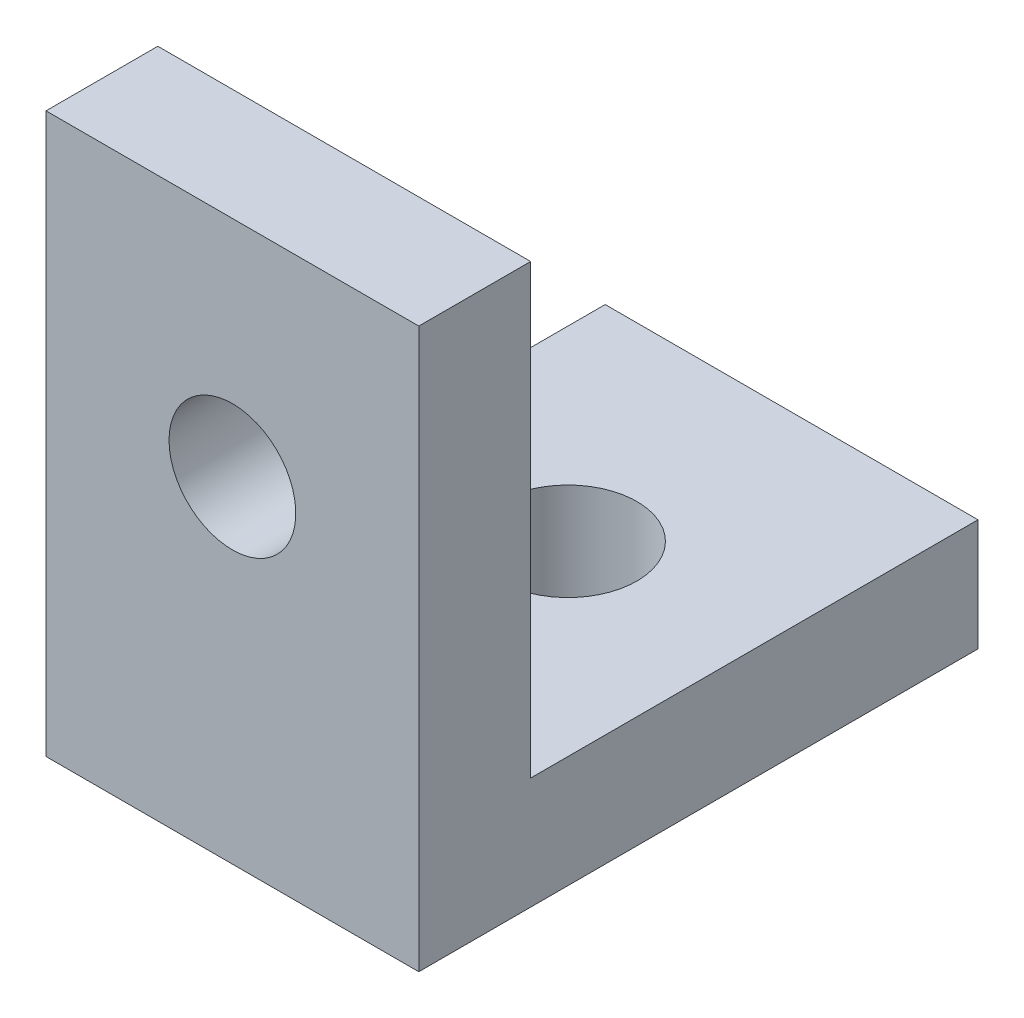
ISO-10303-21;
HEADER;
FILE_DESCRIPTION(('STEP AP214'),'2;1');
FILE_NAME('part.step','',(''),(''),'','','');
FILE_SCHEMA(('AUTOMOTIVE_DESIGN { 1 0 10303 214 1 1 1 1 }'));
ENDSEC;
DATA;
#1=APPLICATION_CONTEXT('core data for automotive mechanical design processes');
#2=APPLICATION_PROTOCOL_DEFINITION('international standard','automotive_design',2000,#1);
#3=PRODUCT_CONTEXT('',#1,'mechanical');
#4=PRODUCT('Part','Part','',(#3));
#5=PRODUCT_RELATED_PRODUCT_CATEGORY('part','',(#4));
#6=PRODUCT_DEFINITION_FORMATION('','',#4);
#7=PRODUCT_DEFINITION_CONTEXT('part definition',#1,'design');
#8=PRODUCT_DEFINITION('design','',#6,#7);
#9=PRODUCT_DEFINITION_SHAPE('','',#8);
#10=(LENGTH_UNIT() NAMED_UNIT(*) SI_UNIT(.MILLI.,.METRE.));
#11=(NAMED_UNIT(*) PLANE_ANGLE_UNIT() SI_UNIT($,.RADIAN.));
#12=(NAMED_UNIT(*) SI_UNIT($,.STERADIAN.) SOLID_ANGLE_UNIT());
#13=UNCERTAINTY_MEASURE_WITH_UNIT(LENGTH_MEASURE(1.E-05),#10,'distance_accuracy_value','');
#14=(GEOMETRIC_REPRESENTATION_CONTEXT(3) GLOBAL_UNCERTAINTY_ASSIGNED_CONTEXT((#13)) GLOBAL_UNIT_ASSIGNED_CONTEXT((#10,
#11,#12)) REPRESENTATION_CONTEXT('',''));
#15=CARTESIAN_POINT('',(0.,0.,0.));
#16=DIRECTION('',(0.,0.,1.));
#17=DIRECTION('',(1.,0.,0.));
#18=AXIS2_PLACEMENT_3D('',#15,#16,#17);
#19=CARTESIAN_POINT('',(10.,-3.,3.));
#20=DIRECTION('',(0.,0.,-1.));
#21=DIRECTION('',(-1.,0.,0.));
#22=AXIS2_PLACEMENT_3D('',#19,#20,#21);
#23=PLANE('',#22);
#24=CARTESIAN_POINT('',(5.,6.,3.));
#25=DIRECTION('',(0.,0.,-1.));
#26=DIRECTION('',(-1.,0.,0.));
#27=AXIS2_PLACEMENT_3D('',#24,#25,#26);
#28=CIRCLE('',#27,1.7);
#29=CARTESIAN_POINT('',(3.3,6.,3.));
#30=VERTEX_POINT('',#29);
#31=EDGE_CURVE('E160',#30,#30,#28,.T.);
#32=ORIENTED_EDGE('',*,*,#31,.T.);
#33=EDGE_LOOP('',(#32));
#34=FACE_BOUND('',#33,.T.);
#35=DIRECTION('',(0.,-1.,0.));
#36=VECTOR('',#35,1.);
#37=CARTESIAN_POINT('',(0.,-3.,3.));
#38=LINE('',#37,#36);
#39=CARTESIAN_POINT('',(0.,12.,3.));
#40=VERTEX_POINT('',#39);
#41=CARTESIAN_POINT('',(0.,-3.,3.));
#42=VERTEX_POINT('',#41);
#43=EDGE_CURVE('E116',#40,#42,#38,.T.);
#44=ORIENTED_EDGE('',*,*,#43,.T.);
#45=DIRECTION('',(-1.,0.,0.));
#46=VECTOR('',#45,1.);
#47=CARTESIAN_POINT('',(10.,-3.,3.));
#48=LINE('',#47,#46);
#49=CARTESIAN_POINT('',(10.,-3.,3.));
#50=VERTEX_POINT('',#49);
#51=EDGE_CURVE('E11',#50,#42,#48,.T.);
#52=ORIENTED_EDGE('',*,*,#51,.F.);
#53=DIRECTION('',(0.,-1.,0.));
#54=VECTOR('',#53,1.);
#55=CARTESIAN_POINT('',(10.,-3.,3.));
#56=LINE('',#55,#54);
#57=CARTESIAN_POINT('',(10.,12.,3.));
#58=VERTEX_POINT('',#57);
#59=EDGE_CURVE('E127',#58,#50,#56,.T.);
#60=ORIENTED_EDGE('',*,*,#59,.F.);
#61=DIRECTION('',(-1.,0.,0.));
#62=VECTOR('',#61,1.);
#63=CARTESIAN_POINT('',(10.,12.,3.));
#64=LINE('',#63,#62);
#65=EDGE_CURVE('E112',#58,#40,#64,.T.);
#66=ORIENTED_EDGE('',*,*,#65,.T.);
#67=EDGE_LOOP('',(#44,#52,#60,#66));
#68=FACE_BOUND('',#67,.T.);
#69=ADVANCED_FACE('F32',(#34,#68),#23,.F.);
#70=CARTESIAN_POINT('',(10.,-3.,-12.));
#71=DIRECTION('',(0.,1.,0.));
#72=DIRECTION('',(0.,0.,1.));
#73=AXIS2_PLACEMENT_3D('',#70,#71,#72);
#74=PLANE('',#73);
#75=CARTESIAN_POINT('',(5.,-3.,-6.));
#76=DIRECTION('',(0.,1.,0.));
#77=DIRECTION('',(0.,0.,1.));
#78=AXIS2_PLACEMENT_3D('',#75,#76,#77);
#79=CIRCLE('',#78,1.85);
#80=CARTESIAN_POINT('',(5.,-3.,-4.15));
#81=VERTEX_POINT('',#80);
#82=EDGE_CURVE('E120',#81,#81,#79,.T.);
#83=ORIENTED_EDGE('',*,*,#82,.T.);
#84=EDGE_LOOP('',(#83));
#85=FACE_BOUND('',#84,.T.);
#86=DIRECTION('',(0.,0.,-1.));
#87=VECTOR('',#86,1.);
#88=CARTESIAN_POINT('',(0.,-3.,-12.));
#89=LINE('',#88,#87);
#90=CARTESIAN_POINT('',(0.,-3.,-12.));
#91=VERTEX_POINT('',#90);
#92=EDGE_CURVE('E119',#42,#91,#89,.T.);
#93=ORIENTED_EDGE('',*,*,#92,.T.);
#94=DIRECTION('',(-1.,0.,0.));
#95=VECTOR('',#94,1.);
#96=CARTESIAN_POINT('',(10.,-3.,-12.));
#97=LINE('',#96,#95);
#98=CARTESIAN_POINT('',(10.,-3.,-12.));
#99=VERTEX_POINT('',#98);
#100=EDGE_CURVE('E40',#99,#91,#97,.T.);
#101=ORIENTED_EDGE('',*,*,#100,.F.);
#102=DIRECTION('',(0.,0.,-1.));
#103=VECTOR('',#102,1.);
#104=CARTESIAN_POINT('',(10.,-3.,-12.));
#105=LINE('',#104,#103);
#106=EDGE_CURVE('E85',#50,#99,#105,.T.);
#107=ORIENTED_EDGE('',*,*,#106,.F.);
#108=ORIENTED_EDGE('',*,*,#51,.T.);
#109=EDGE_LOOP('',(#93,#101,#107,#108));
#110=FACE_BOUND('',#109,.T.);
#111=ADVANCED_FACE('F152',(#85,#110),#74,.F.);
#112=CARTESIAN_POINT('',(10.,0.,-12.));
#113=DIRECTION('',(0.,0.,1.));
#114=DIRECTION('',(1.,0.,0.));
#115=AXIS2_PLACEMENT_3D('',#112,#113,#114);
#116=PLANE('',#115);
#117=DIRECTION('',(0.,1.,0.));
#118=VECTOR('',#117,1.);
#119=CARTESIAN_POINT('',(0.,0.,-12.));
#120=LINE('',#119,#118);
#121=CARTESIAN_POINT('',(0.,0.,-12.));
#122=VERTEX_POINT('',#121);
#123=EDGE_CURVE('E122',#91,#122,#120,.T.);
#124=ORIENTED_EDGE('',*,*,#123,.T.);
#125=DIRECTION('',(-1.,0.,0.));
#126=VECTOR('',#125,1.);
#127=CARTESIAN_POINT('',(10.,0.,-12.));
#128=LINE('',#127,#126);
#129=CARTESIAN_POINT('',(10.,0.,-12.));
#130=VERTEX_POINT('',#129);
#131=EDGE_CURVE('E107',#130,#122,#128,.T.);
#132=ORIENTED_EDGE('',*,*,#131,.F.);
#133=DIRECTION('',(0.,1.,0.));
#134=VECTOR('',#133,1.);
#135=CARTESIAN_POINT('',(10.,0.,-12.));
#136=LINE('',#135,#134);
#137=EDGE_CURVE('E98',#99,#130,#136,.T.);
#138=ORIENTED_EDGE('',*,*,#137,.F.);
#139=ORIENTED_EDGE('',*,*,#100,.T.);
#140=EDGE_LOOP('',(#124,#132,#138,#139));
#141=FACE_BOUND('',#140,.T.);
#142=ADVANCED_FACE('F133',(#141),#116,.F.);
#143=CARTESIAN_POINT('',(10.,0.,0.));
#144=DIRECTION('',(0.,-1.,0.));
#145=DIRECTION('',(0.,0.,-1.));
#146=AXIS2_PLACEMENT_3D('',#143,#144,#145);
#147=PLANE('',#146);
#148=CARTESIAN_POINT('',(5.,0.,-6.));
#149=DIRECTION('',(0.,1.,0.));
#150=DIRECTION('',(0.,0.,1.));
#151=AXIS2_PLACEMENT_3D('',#148,#149,#150);
#152=CIRCLE('',#151,1.85);
#153=CARTESIAN_POINT('',(5.,0.,-4.15));
#154=VERTEX_POINT('',#153);
#155=EDGE_CURVE('E162',#154,#154,#152,.T.);
#156=ORIENTED_EDGE('',*,*,#155,.F.);
#157=EDGE_LOOP('',(#156));
#158=FACE_BOUND('',#157,.T.);
#159=DIRECTION('',(0.,0.,1.));
#160=VECTOR('',#159,1.);
#161=CARTESIAN_POINT('',(0.,0.,0.));
#162=LINE('',#161,#160);
#163=CARTESIAN_POINT('',(0.,0.,0.));
#164=VERTEX_POINT('',#163);
#165=EDGE_CURVE('E106',#122,#164,#162,.T.);
#166=ORIENTED_EDGE('',*,*,#165,.T.);
#167=DIRECTION('',(-1.,0.,0.));
#168=VECTOR('',#167,1.);
#169=CARTESIAN_POINT('',(10.,0.,0.));
#170=LINE('',#169,#168);
#171=CARTESIAN_POINT('',(10.,0.,0.));
#172=VERTEX_POINT('',#171);
#173=EDGE_CURVE('E103',#172,#164,#170,.T.);
#174=ORIENTED_EDGE('',*,*,#173,.F.);
#175=DIRECTION('',(0.,0.,1.));
#176=VECTOR('',#175,1.);
#177=CARTESIAN_POINT('',(10.,0.,0.));
#178=LINE('',#177,#176);
#179=EDGE_CURVE('E92',#130,#172,#178,.T.);
#180=ORIENTED_EDGE('',*,*,#179,.F.);
#181=ORIENTED_EDGE('',*,*,#131,.T.);
#182=EDGE_LOOP('',(#166,#174,#180,#181));
#183=FACE_BOUND('',#182,.T.);
#184=ADVANCED_FACE('F104',(#158,#183),#147,.F.);
#185=CARTESIAN_POINT('',(10.,12.,0.));
#186=DIRECTION('',(0.,0.,1.));
#187=DIRECTION('',(0.,-1.,0.));
#188=AXIS2_PLACEMENT_3D('',#185,#186,#187);
#189=PLANE('',#188);
#190=CARTESIAN_POINT('',(5.,6.,0.));
#191=DIRECTION('',(0.,0.,-1.));
#192=DIRECTION('',(-1.,0.,0.));
#193=AXIS2_PLACEMENT_3D('',#190,#191,#192);
#194=CIRCLE('',#193,1.7);
#195=CARTESIAN_POINT('',(3.3,6.,0.));
#196=VERTEX_POINT('',#195);
#197=EDGE_CURVE('E163',#196,#196,#194,.T.);
#198=ORIENTED_EDGE('',*,*,#197,.F.);
#199=EDGE_LOOP('',(#198));
#200=FACE_BOUND('',#199,.T.);
#201=DIRECTION('',(0.,1.,0.));
#202=VECTOR('',#201,1.);
#203=CARTESIAN_POINT('',(0.,12.,0.));
#204=LINE('',#203,#202);
#205=CARTESIAN_POINT('',(0.,12.,0.));
#206=VERTEX_POINT('',#205);
#207=EDGE_CURVE('E71',#164,#206,#204,.T.);
#208=ORIENTED_EDGE('',*,*,#207,.T.);
#209=DIRECTION('',(-1.,0.,0.));
#210=VECTOR('',#209,1.);
#211=CARTESIAN_POINT('',(10.,12.,0.));
#212=LINE('',#211,#210);
#213=CARTESIAN_POINT('',(10.,12.,0.));
#214=VERTEX_POINT('',#213);
#215=EDGE_CURVE('E108',#214,#206,#212,.T.);
#216=ORIENTED_EDGE('',*,*,#215,.F.);
#217=DIRECTION('',(0.,1.,0.));
#218=VECTOR('',#217,1.);
#219=CARTESIAN_POINT('',(10.,12.,0.));
#220=LINE('',#219,#218);
#221=EDGE_CURVE('E96',#172,#214,#220,.T.);
#222=ORIENTED_EDGE('',*,*,#221,.F.);
#223=ORIENTED_EDGE('',*,*,#173,.T.);
#224=EDGE_LOOP('',(#208,#216,#222,#223));
#225=FACE_BOUND('',#224,.T.);
#226=ADVANCED_FACE('F110',(#200,#225),#189,.F.);
#227=CARTESIAN_POINT('',(10.,12.,3.));
#228=DIRECTION('',(0.,-1.,0.));
#229=DIRECTION('',(0.,0.,-1.));
#230=AXIS2_PLACEMENT_3D('',#227,#228,#229);
#231=PLANE('',#230);
#232=DIRECTION('',(0.,0.,1.));
#233=VECTOR('',#232,1.);
#234=CARTESIAN_POINT('',(0.,12.,3.));
#235=LINE('',#234,#233);
#236=EDGE_CURVE('E77',#206,#40,#235,.T.);
#237=ORIENTED_EDGE('',*,*,#236,.T.);
#238=ORIENTED_EDGE('',*,*,#65,.F.);
#239=DIRECTION('',(0.,0.,1.));
#240=VECTOR('',#239,1.);
#241=CARTESIAN_POINT('',(10.,12.,3.));
#242=LINE('',#241,#240);
#243=EDGE_CURVE('E48',#214,#58,#242,.T.);
#244=ORIENTED_EDGE('',*,*,#243,.F.);
#245=ORIENTED_EDGE('',*,*,#215,.T.);
#246=EDGE_LOOP('',(#237,#238,#244,#245));
#247=FACE_BOUND('',#246,.T.);
#248=ADVANCED_FACE('F140',(#247),#231,.F.);
#249=CARTESIAN_POINT('',(10.,0.,0.));
#250=DIRECTION('',(-1.,0.,0.));
#251=DIRECTION('',(0.,0.,1.));
#252=AXIS2_PLACEMENT_3D('',#249,#250,#251);
#253=PLANE('',#252);
#254=ORIENTED_EDGE('',*,*,#59,.T.);
#255=ORIENTED_EDGE('',*,*,#106,.T.);
#256=ORIENTED_EDGE('',*,*,#137,.T.);
#257=ORIENTED_EDGE('',*,*,#179,.T.);
#258=ORIENTED_EDGE('',*,*,#221,.T.);
#259=ORIENTED_EDGE('',*,*,#243,.T.);
#260=EDGE_LOOP('',(#254,#255,#256,#257,#258,#259));
#261=FACE_BOUND('',#260,.T.);
#262=ADVANCED_FACE('F94',(#261),#253,.F.);
#263=CARTESIAN_POINT('',(0.,0.,0.));
#264=DIRECTION('',(-1.,0.,0.));
#265=DIRECTION('',(0.,0.,1.));
#266=AXIS2_PLACEMENT_3D('',#263,#264,#265);
#267=PLANE('',#266);
#268=ORIENTED_EDGE('',*,*,#43,.F.);
#269=ORIENTED_EDGE('',*,*,#236,.F.);
#270=ORIENTED_EDGE('',*,*,#207,.F.);
#271=ORIENTED_EDGE('',*,*,#165,.F.);
#272=ORIENTED_EDGE('',*,*,#123,.F.);
#273=ORIENTED_EDGE('',*,*,#92,.F.);
#274=EDGE_LOOP('',(#268,#269,#270,#271,#272,#273));
#275=FACE_BOUND('',#274,.T.);
#276=ADVANCED_FACE('F136',(#275),#267,.T.);
#277=CARTESIAN_POINT('',(5.,-3.,-6.));
#278=DIRECTION('',(0.,1.,0.));
#279=DIRECTION('',(0.,0.,1.));
#280=AXIS2_PLACEMENT_3D('',#277,#278,#279);
#281=CYLINDRICAL_SURFACE('',#280,1.85);
#282=ORIENTED_EDGE('',*,*,#82,.F.);
#283=EDGE_LOOP('',(#282));
#284=FACE_BOUND('',#283,.T.);
#285=ORIENTED_EDGE('',*,*,#155,.T.);
#286=EDGE_LOOP('',(#285));
#287=FACE_BOUND('',#286,.T.);
#288=ADVANCED_FACE('F175',(#284,#287),#281,.F.);
#289=CARTESIAN_POINT('',(5.,6.,3.));
#290=DIRECTION('',(0.,0.,-1.));
#291=DIRECTION('',(-1.,0.,0.));
#292=AXIS2_PLACEMENT_3D('',#289,#290,#291);
#293=CYLINDRICAL_SURFACE('',#292,1.7);
#294=ORIENTED_EDGE('',*,*,#31,.F.);
#295=EDGE_LOOP('',(#294));
#296=FACE_BOUND('',#295,.T.);
#297=ORIENTED_EDGE('',*,*,#197,.T.);
#298=EDGE_LOOP('',(#297));
#299=FACE_BOUND('',#298,.T.);
#300=ADVANCED_FACE('F178',(#296,#299),#293,.F.);
#301=CLOSED_SHELL('',(#69,#111,#142,#184,#226,#248,#262,#276,#288,#300));
#302=MANIFOLD_SOLID_BREP('B2',#301);
#303=ADVANCED_BREP_SHAPE_REPRESENTATION('',(#18,#302),#14);
#304=SHAPE_DEFINITION_REPRESENTATION(#9,#303);
ENDSEC;
END-ISO-10303-21;
